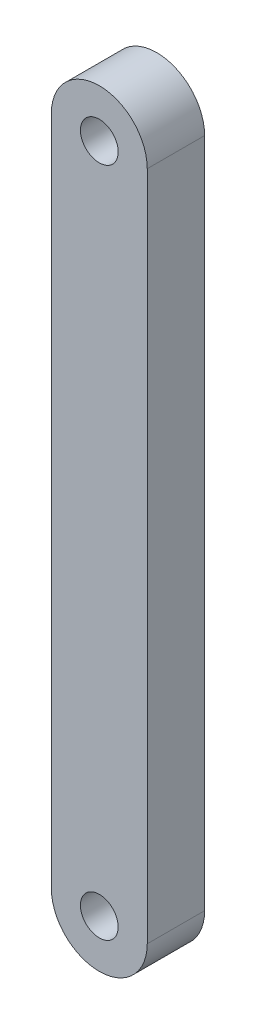
ISO-10303-21;
HEADER;
FILE_DESCRIPTION(('STEP AP214'),'2;1');
FILE_NAME('part.step','',(''),(''),'','','');
FILE_SCHEMA(('AUTOMOTIVE_DESIGN { 1 0 10303 214 1 1 1 1 }'));
ENDSEC;
DATA;
#1=APPLICATION_CONTEXT('core data for automotive mechanical design processes');
#2=APPLICATION_PROTOCOL_DEFINITION('international standard','automotive_design',2000,#1);
#3=PRODUCT_CONTEXT('',#1,'mechanical');
#4=PRODUCT('Part','Part','',(#3));
#5=PRODUCT_RELATED_PRODUCT_CATEGORY('part','',(#4));
#6=PRODUCT_DEFINITION_FORMATION('','',#4);
#7=PRODUCT_DEFINITION_CONTEXT('part definition',#1,'design');
#8=PRODUCT_DEFINITION('design','',#6,#7);
#9=PRODUCT_DEFINITION_SHAPE('','',#8);
#10=(LENGTH_UNIT() NAMED_UNIT(*) SI_UNIT(.MILLI.,.METRE.));
#11=(NAMED_UNIT(*) PLANE_ANGLE_UNIT() SI_UNIT($,.RADIAN.));
#12=(NAMED_UNIT(*) SI_UNIT($,.STERADIAN.) SOLID_ANGLE_UNIT());
#13=UNCERTAINTY_MEASURE_WITH_UNIT(LENGTH_MEASURE(1.E-05),#10,'distance_accuracy_value','');
#14=(GEOMETRIC_REPRESENTATION_CONTEXT(3) GLOBAL_UNCERTAINTY_ASSIGNED_CONTEXT((#13)) GLOBAL_UNIT_ASSIGNED_CONTEXT((#10,
#11,#12)) REPRESENTATION_CONTEXT('',''));
#15=CARTESIAN_POINT('',(0.,0.,0.));
#16=DIRECTION('',(0.,0.,1.));
#17=DIRECTION('',(1.,0.,0.));
#18=AXIS2_PLACEMENT_3D('',#15,#16,#17);
#19=CARTESIAN_POINT('',(159.50544618157,138.713740267124,0.76));
#20=DIRECTION('',(0.,0.,-1.));
#21=DIRECTION('',(-1.,0.,0.));
#22=AXIS2_PLACEMENT_3D('',#19,#20,#21);
#23=CYLINDRICAL_SURFACE('',#22,0.634999999999983);
#24=CARTESIAN_POINT('',(159.50544618157,138.713740267124,0.));
#25=DIRECTION('',(0.,0.,1.));
#26=DIRECTION('',(1.,0.,0.));
#27=AXIS2_PLACEMENT_3D('',#24,#25,#26);
#28=CIRCLE('',#27,0.634999999999983);
#29=CARTESIAN_POINT('',(160.14044618157,138.713740267124,0.));
#30=VERTEX_POINT('',#29);
#31=CARTESIAN_POINT('',(158.87044618157,138.713740267124,0.));
#32=VERTEX_POINT('',#31);
#33=EDGE_CURVE('E103',#30,#32,#28,.T.);
#34=ORIENTED_EDGE('',*,*,#33,.T.);
#35=DIRECTION('',(0.,0.,-1.));
#36=VECTOR('',#35,1.);
#37=CARTESIAN_POINT('',(158.87044618157,138.713740267124,0.76));
#38=LINE('',#37,#36);
#39=CARTESIAN_POINT('',(158.87044618157,138.713740267124,0.76));
#40=VERTEX_POINT('',#39);
#41=EDGE_CURVE('E11',#40,#32,#38,.T.);
#42=ORIENTED_EDGE('',*,*,#41,.F.);
#43=CARTESIAN_POINT('',(159.50544618157,138.713740267124,0.76));
#44=DIRECTION('',(0.,0.,1.));
#45=DIRECTION('',(1.,0.,0.));
#46=AXIS2_PLACEMENT_3D('',#43,#44,#45);
#47=CIRCLE('',#46,0.634999999999983);
#48=CARTESIAN_POINT('',(160.14044618157,138.713740267124,0.76));
#49=VERTEX_POINT('',#48);
#50=EDGE_CURVE('E90',#49,#40,#47,.T.);
#51=ORIENTED_EDGE('',*,*,#50,.F.);
#52=DIRECTION('',(0.,0.,-1.));
#53=VECTOR('',#52,1.);
#54=CARTESIAN_POINT('',(160.14044618157,138.713740267124,0.76));
#55=LINE('',#54,#53);
#56=EDGE_CURVE('E99',#49,#30,#55,.T.);
#57=ORIENTED_EDGE('',*,*,#56,.T.);
#58=EDGE_LOOP('',(#34,#42,#51,#57));
#59=FACE_BOUND('',#58,.T.);
#60=ADVANCED_FACE('F37',(#59),#23,.T.);
#61=CARTESIAN_POINT('',(158.87044618157,138.713740267124,0.76));
#62=DIRECTION('',(1.,0.,0.));
#63=DIRECTION('',(0.,0.,-1.));
#64=AXIS2_PLACEMENT_3D('',#61,#62,#63);
#65=PLANE('',#64);
#66=DIRECTION('',(0.,-1.,0.));
#67=VECTOR('',#66,1.);
#68=CARTESIAN_POINT('',(158.87044618157,138.713740267124,0.));
#69=LINE('',#68,#67);
#70=CARTESIAN_POINT('',(158.87044618157,129.823740267124,0.));
#71=VERTEX_POINT('',#70);
#72=EDGE_CURVE('E94',#32,#71,#69,.T.);
#73=ORIENTED_EDGE('',*,*,#72,.T.);
#74=DIRECTION('',(0.,0.,-1.));
#75=VECTOR('',#74,1.);
#76=CARTESIAN_POINT('',(158.87044618157,129.823740267124,0.76));
#77=LINE('',#76,#75);
#78=CARTESIAN_POINT('',(158.87044618157,129.823740267124,0.76));
#79=VERTEX_POINT('',#78);
#80=EDGE_CURVE('E46',#79,#71,#77,.T.);
#81=ORIENTED_EDGE('',*,*,#80,.F.);
#82=DIRECTION('',(0.,-1.,0.));
#83=VECTOR('',#82,1.);
#84=CARTESIAN_POINT('',(158.87044618157,138.713740267124,0.76));
#85=LINE('',#84,#83);
#86=EDGE_CURVE('E85',#40,#79,#85,.T.);
#87=ORIENTED_EDGE('',*,*,#86,.F.);
#88=ORIENTED_EDGE('',*,*,#41,.T.);
#89=EDGE_LOOP('',(#73,#81,#87,#88));
#90=FACE_BOUND('',#89,.T.);
#91=ADVANCED_FACE('F93',(#90),#65,.F.);
#92=CARTESIAN_POINT('',(159.50544618157,129.823740267124,0.76));
#93=DIRECTION('',(0.,0.,-1.));
#94=DIRECTION('',(-1.,0.,0.));
#95=AXIS2_PLACEMENT_3D('',#92,#93,#94);
#96=CYLINDRICAL_SURFACE('',#95,0.634999999999983);
#97=CARTESIAN_POINT('',(159.50544618157,129.823740267124,0.));
#98=DIRECTION('',(0.,0.,1.));
#99=DIRECTION('',(1.,0.,0.));
#100=AXIS2_PLACEMENT_3D('',#97,#98,#99);
#101=CIRCLE('',#100,0.634999999999983);
#102=CARTESIAN_POINT('',(160.14044618157,129.823740267124,0.));
#103=VERTEX_POINT('',#102);
#104=EDGE_CURVE('E72',#71,#103,#101,.T.);
#105=ORIENTED_EDGE('',*,*,#104,.T.);
#106=DIRECTION('',(0.,0.,-1.));
#107=VECTOR('',#106,1.);
#108=CARTESIAN_POINT('',(160.14044618157,129.823740267124,0.76));
#109=LINE('',#108,#107);
#110=CARTESIAN_POINT('',(160.14044618157,129.823740267124,0.76));
#111=VERTEX_POINT('',#110);
#112=EDGE_CURVE('E95',#111,#103,#109,.T.);
#113=ORIENTED_EDGE('',*,*,#112,.F.);
#114=CARTESIAN_POINT('',(159.50544618157,129.823740267124,0.76));
#115=DIRECTION('',(0.,0.,1.));
#116=DIRECTION('',(1.,0.,0.));
#117=AXIS2_PLACEMENT_3D('',#114,#115,#116);
#118=CIRCLE('',#117,0.634999999999983);
#119=EDGE_CURVE('E88',#79,#111,#118,.T.);
#120=ORIENTED_EDGE('',*,*,#119,.F.);
#121=ORIENTED_EDGE('',*,*,#80,.T.);
#122=EDGE_LOOP('',(#105,#113,#120,#121));
#123=FACE_BOUND('',#122,.T.);
#124=ADVANCED_FACE('F97',(#123),#96,.T.);
#125=CARTESIAN_POINT('',(160.14044618157,129.823740267124,0.76));
#126=DIRECTION('',(-1.,0.,0.));
#127=DIRECTION('',(0.,0.,1.));
#128=AXIS2_PLACEMENT_3D('',#125,#126,#127);
#129=PLANE('',#128);
#130=DIRECTION('',(0.,1.,0.));
#131=VECTOR('',#130,1.);
#132=CARTESIAN_POINT('',(160.14044618157,129.823740267124,0.));
#133=LINE('',#132,#131);
#134=EDGE_CURVE('E78',#103,#30,#133,.T.);
#135=ORIENTED_EDGE('',*,*,#134,.T.);
#136=ORIENTED_EDGE('',*,*,#56,.F.);
#137=DIRECTION('',(0.,1.,0.));
#138=VECTOR('',#137,1.);
#139=CARTESIAN_POINT('',(160.14044618157,129.823740267124,0.76));
#140=LINE('',#139,#138);
#141=EDGE_CURVE('E55',#111,#49,#140,.T.);
#142=ORIENTED_EDGE('',*,*,#141,.F.);
#143=ORIENTED_EDGE('',*,*,#112,.T.);
#144=EDGE_LOOP('',(#135,#136,#142,#143));
#145=FACE_BOUND('',#144,.T.);
#146=ADVANCED_FACE('F130',(#145),#129,.F.);
#147=CARTESIAN_POINT('',(159.50544618157,138.713740267124,0.76));
#148=DIRECTION('',(0.,0.,1.));
#149=DIRECTION('',(1.,0.,0.));
#150=AXIS2_PLACEMENT_3D('',#147,#148,#149);
#151=PLANE('',#150);
#152=CARTESIAN_POINT('',(159.50544618157,138.713740267124,0.76));
#153=DIRECTION('',(0.,0.,1.));
#154=DIRECTION('',(1.,0.,0.));
#155=AXIS2_PLACEMENT_3D('',#152,#153,#154);
#156=CIRCLE('',#155,0.250000000000013);
#157=CARTESIAN_POINT('',(159.75544618157,138.713740267124,0.76));
#158=VERTEX_POINT('',#157);
#159=EDGE_CURVE('E112',#158,#158,#156,.T.);
#160=ORIENTED_EDGE('',*,*,#159,.F.);
#161=EDGE_LOOP('',(#160));
#162=FACE_BOUND('',#161,.T.);
#163=CARTESIAN_POINT('',(159.50544618157,129.823740267124,0.76));
#164=DIRECTION('',(0.,0.,1.));
#165=DIRECTION('',(1.,0.,0.));
#166=AXIS2_PLACEMENT_3D('',#163,#164,#165);
#167=CIRCLE('',#166,0.250000000000013);
#168=CARTESIAN_POINT('',(159.75544618157,129.823740267124,0.76));
#169=VERTEX_POINT('',#168);
#170=EDGE_CURVE('E117',#169,#169,#167,.T.);
#171=ORIENTED_EDGE('',*,*,#170,.F.);
#172=EDGE_LOOP('',(#171));
#173=FACE_BOUND('',#172,.T.);
#174=ORIENTED_EDGE('',*,*,#50,.T.);
#175=ORIENTED_EDGE('',*,*,#86,.T.);
#176=ORIENTED_EDGE('',*,*,#119,.T.);
#177=ORIENTED_EDGE('',*,*,#141,.T.);
#178=EDGE_LOOP('',(#174,#175,#176,#177));
#179=FACE_BOUND('',#178,.T.);
#180=ADVANCED_FACE('F86',(#162,#173,#179),#151,.T.);
#181=CARTESIAN_POINT('',(159.50544618157,138.713740267124,0.));
#182=DIRECTION('',(0.,0.,1.));
#183=DIRECTION('',(1.,0.,0.));
#184=AXIS2_PLACEMENT_3D('',#181,#182,#183);
#185=PLANE('',#184);
#186=CARTESIAN_POINT('',(159.50544618157,138.713740267124,0.));
#187=DIRECTION('',(0.,0.,1.));
#188=DIRECTION('',(1.,0.,0.));
#189=AXIS2_PLACEMENT_3D('',#186,#187,#188);
#190=CIRCLE('',#189,0.250000000000013);
#191=CARTESIAN_POINT('',(159.75544618157,138.713740267124,0.));
#192=VERTEX_POINT('',#191);
#193=EDGE_CURVE('E40',#192,#192,#190,.T.);
#194=ORIENTED_EDGE('',*,*,#193,.T.);
#195=EDGE_LOOP('',(#194));
#196=FACE_BOUND('',#195,.T.);
#197=CARTESIAN_POINT('',(159.50544618157,129.823740267124,0.));
#198=DIRECTION('',(0.,0.,1.));
#199=DIRECTION('',(1.,0.,0.));
#200=AXIS2_PLACEMENT_3D('',#197,#198,#199);
#201=CIRCLE('',#200,0.250000000000013);
#202=CARTESIAN_POINT('',(159.75544618157,129.823740267124,0.));
#203=VERTEX_POINT('',#202);
#204=EDGE_CURVE('E110',#203,#203,#201,.T.);
#205=ORIENTED_EDGE('',*,*,#204,.T.);
#206=EDGE_LOOP('',(#205));
#207=FACE_BOUND('',#206,.T.);
#208=ORIENTED_EDGE('',*,*,#33,.F.);
#209=ORIENTED_EDGE('',*,*,#134,.F.);
#210=ORIENTED_EDGE('',*,*,#104,.F.);
#211=ORIENTED_EDGE('',*,*,#72,.F.);
#212=EDGE_LOOP('',(#208,#209,#210,#211));
#213=FACE_BOUND('',#212,.T.);
#214=ADVANCED_FACE('F129',(#196,#207,#213),#185,.F.);
#215=CARTESIAN_POINT('',(159.50544618157,129.823740267124,-2.));
#216=DIRECTION('',(0.,0.,1.));
#217=DIRECTION('',(1.,0.,0.));
#218=AXIS2_PLACEMENT_3D('',#215,#216,#217);
#219=CYLINDRICAL_SURFACE('',#218,0.250000000000013);
#220=ORIENTED_EDGE('',*,*,#170,.T.);
#221=EDGE_LOOP('',(#220));
#222=FACE_BOUND('',#221,.T.);
#223=ORIENTED_EDGE('',*,*,#204,.F.);
#224=EDGE_LOOP('',(#223));
#225=FACE_BOUND('',#224,.T.);
#226=ADVANCED_FACE('F125',(#222,#225),#219,.F.);
#227=CARTESIAN_POINT('',(159.50544618157,138.713740267124,-2.));
#228=DIRECTION('',(0.,0.,1.));
#229=DIRECTION('',(1.,0.,0.));
#230=AXIS2_PLACEMENT_3D('',#227,#228,#229);
#231=CYLINDRICAL_SURFACE('',#230,0.250000000000013);
#232=ORIENTED_EDGE('',*,*,#159,.T.);
#233=EDGE_LOOP('',(#232));
#234=FACE_BOUND('',#233,.T.);
#235=ORIENTED_EDGE('',*,*,#193,.F.);
#236=EDGE_LOOP('',(#235));
#237=FACE_BOUND('',#236,.T.);
#238=ADVANCED_FACE('F177',(#234,#237),#231,.F.);
#239=CLOSED_SHELL('',(#60,#91,#124,#146,#180,#214,#226,#238));
#240=MANIFOLD_SOLID_BREP('B2',#239);
#241=ADVANCED_BREP_SHAPE_REPRESENTATION('',(#18,#240),#14);
#242=SHAPE_DEFINITION_REPRESENTATION(#9,#241);
ENDSEC;
END-ISO-10303-21;
